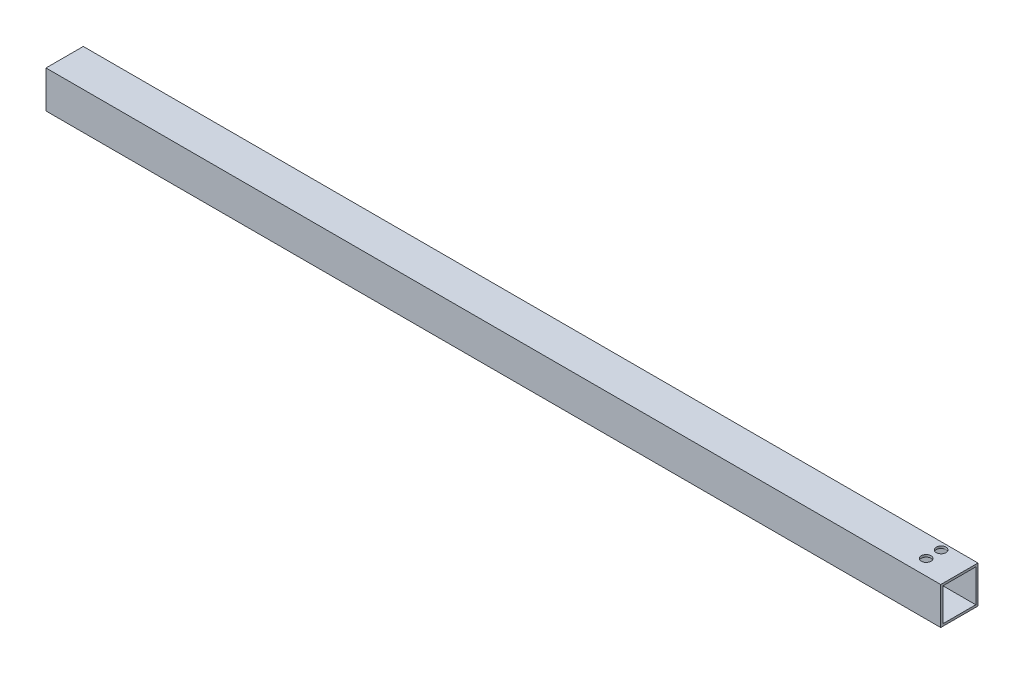
ISO-10303-21;
HEADER;
FILE_DESCRIPTION(('STEP AP214'),'2;1');
FILE_NAME('part.step','',(''),(''),'','','');
FILE_SCHEMA(('AUTOMOTIVE_DESIGN { 1 0 10303 214 1 1 1 1 }'));
ENDSEC;
DATA;
#1=APPLICATION_CONTEXT('core data for automotive mechanical design processes');
#2=APPLICATION_PROTOCOL_DEFINITION('international standard','automotive_design',2000,#1);
#3=PRODUCT_CONTEXT('',#1,'mechanical');
#4=PRODUCT('Part','Part','',(#3));
#5=PRODUCT_RELATED_PRODUCT_CATEGORY('part','',(#4));
#6=PRODUCT_DEFINITION_FORMATION('','',#4);
#7=PRODUCT_DEFINITION_CONTEXT('part definition',#1,'design');
#8=PRODUCT_DEFINITION('design','',#6,#7);
#9=PRODUCT_DEFINITION_SHAPE('','',#8);
#10=(LENGTH_UNIT() NAMED_UNIT(*) SI_UNIT(.MILLI.,.METRE.));
#11=(NAMED_UNIT(*) PLANE_ANGLE_UNIT() SI_UNIT($,.RADIAN.));
#12=(NAMED_UNIT(*) SI_UNIT($,.STERADIAN.) SOLID_ANGLE_UNIT());
#13=UNCERTAINTY_MEASURE_WITH_UNIT(LENGTH_MEASURE(1.E-05),#10,'distance_accuracy_value','');
#14=(GEOMETRIC_REPRESENTATION_CONTEXT(3) GLOBAL_UNCERTAINTY_ASSIGNED_CONTEXT((#13)) GLOBAL_UNIT_ASSIGNED_CONTEXT((#10,
#11,#12)) REPRESENTATION_CONTEXT('',''));
#15=CARTESIAN_POINT('',(0.,0.,0.));
#16=DIRECTION('',(0.,0.,1.));
#17=DIRECTION('',(1.,0.,0.));
#18=AXIS2_PLACEMENT_3D('',#15,#16,#17);
#19=CARTESIAN_POINT('',(1200.,0.,0.));
#20=DIRECTION('',(1.,0.,0.));
#21=DIRECTION('',(0.,0.,-1.));
#22=AXIS2_PLACEMENT_3D('',#19,#20,#21);
#23=PLANE('',#22);
#24=DIRECTION('',(0.,-1.,0.));
#25=VECTOR('',#24,1.);
#26=CARTESIAN_POINT('',(1200.,25.,25.));
#27=LINE('',#26,#25);
#28=CARTESIAN_POINT('',(1200.,25.,25.));
#29=VERTEX_POINT('',#28);
#30=CARTESIAN_POINT('',(1200.,-25.,25.));
#31=VERTEX_POINT('',#30);
#32=EDGE_CURVE('E151',#29,#31,#27,.T.);
#33=ORIENTED_EDGE('',*,*,#32,.T.);
#34=DIRECTION('',(0.,0.,-1.));
#35=VECTOR('',#34,1.);
#36=CARTESIAN_POINT('',(1200.,-25.,25.));
#37=LINE('',#36,#35);
#38=CARTESIAN_POINT('',(1200.,-25.,-25.));
#39=VERTEX_POINT('',#38);
#40=EDGE_CURVE('E154',#31,#39,#37,.T.);
#41=ORIENTED_EDGE('',*,*,#40,.T.);
#42=DIRECTION('',(0.,1.,0.));
#43=VECTOR('',#42,1.);
#44=CARTESIAN_POINT('',(1200.,25.,-25.));
#45=LINE('',#44,#43);
#46=CARTESIAN_POINT('',(1200.,25.,-25.));
#47=VERTEX_POINT('',#46);
#48=EDGE_CURVE('E157',#39,#47,#45,.T.);
#49=ORIENTED_EDGE('',*,*,#48,.T.);
#50=DIRECTION('',(0.,0.,1.));
#51=VECTOR('',#50,1.);
#52=CARTESIAN_POINT('',(1200.,25.,25.));
#53=LINE('',#52,#51);
#54=EDGE_CURVE('E159',#47,#29,#53,.T.);
#55=ORIENTED_EDGE('',*,*,#54,.T.);
#56=EDGE_LOOP('',(#33,#41,#49,#55));
#57=FACE_BOUND('',#56,.T.);
#58=DIRECTION('',(0.,-1.,0.));
#59=VECTOR('',#58,1.);
#60=CARTESIAN_POINT('',(1200.,22.,22.));
#61=LINE('',#60,#59);
#62=CARTESIAN_POINT('',(1200.,22.,22.));
#63=VERTEX_POINT('',#62);
#64=CARTESIAN_POINT('',(1200.,-22.,22.));
#65=VERTEX_POINT('',#64);
#66=EDGE_CURVE('E115',#63,#65,#61,.T.);
#67=ORIENTED_EDGE('',*,*,#66,.F.);
#68=DIRECTION('',(0.,0.,1.));
#69=VECTOR('',#68,1.);
#70=CARTESIAN_POINT('',(1200.,22.,22.));
#71=LINE('',#70,#69);
#72=CARTESIAN_POINT('',(1200.,22.,-22.));
#73=VERTEX_POINT('',#72);
#74=EDGE_CURVE('E103',#73,#63,#71,.T.);
#75=ORIENTED_EDGE('',*,*,#74,.F.);
#76=DIRECTION('',(0.,1.,0.));
#77=VECTOR('',#76,1.);
#78=CARTESIAN_POINT('',(1200.,22.,-22.));
#79=LINE('',#78,#77);
#80=CARTESIAN_POINT('',(1200.,-22.,-22.));
#81=VERTEX_POINT('',#80);
#82=EDGE_CURVE('E130',#81,#73,#79,.T.);
#83=ORIENTED_EDGE('',*,*,#82,.F.);
#84=DIRECTION('',(0.,0.,-1.));
#85=VECTOR('',#84,1.);
#86=CARTESIAN_POINT('',(1200.,-22.,22.));
#87=LINE('',#86,#85);
#88=EDGE_CURVE('E128',#65,#81,#87,.T.);
#89=ORIENTED_EDGE('',*,*,#88,.F.);
#90=EDGE_LOOP('',(#67,#75,#83,#89));
#91=FACE_BOUND('',#90,.T.);
#92=ADVANCED_FACE('F33',(#57,#91),#23,.T.);
#93=CARTESIAN_POINT('',(0.,0.,0.));
#94=DIRECTION('',(1.,0.,0.));
#95=DIRECTION('',(0.,0.,-1.));
#96=AXIS2_PLACEMENT_3D('',#93,#94,#95);
#97=PLANE('',#96);
#98=DIRECTION('',(0.,-1.,0.));
#99=VECTOR('',#98,1.);
#100=CARTESIAN_POINT('',(0.,25.,25.));
#101=LINE('',#100,#99);
#102=CARTESIAN_POINT('',(0.,25.,25.));
#103=VERTEX_POINT('',#102);
#104=CARTESIAN_POINT('',(0.,-25.,25.));
#105=VERTEX_POINT('',#104);
#106=EDGE_CURVE('E123',#103,#105,#101,.T.);
#107=ORIENTED_EDGE('',*,*,#106,.F.);
#108=DIRECTION('',(0.,0.,1.));
#109=VECTOR('',#108,1.);
#110=CARTESIAN_POINT('',(0.,25.,25.));
#111=LINE('',#110,#109);
#112=CARTESIAN_POINT('',(0.,25.,-25.));
#113=VERTEX_POINT('',#112);
#114=EDGE_CURVE('E155',#113,#103,#111,.T.);
#115=ORIENTED_EDGE('',*,*,#114,.F.);
#116=DIRECTION('',(0.,1.,0.));
#117=VECTOR('',#116,1.);
#118=CARTESIAN_POINT('',(0.,25.,-25.));
#119=LINE('',#118,#117);
#120=CARTESIAN_POINT('',(0.,-25.,-25.));
#121=VERTEX_POINT('',#120);
#122=EDGE_CURVE('E166',#121,#113,#119,.T.);
#123=ORIENTED_EDGE('',*,*,#122,.F.);
#124=DIRECTION('',(0.,0.,-1.));
#125=VECTOR('',#124,1.);
#126=CARTESIAN_POINT('',(0.,-25.,25.));
#127=LINE('',#126,#125);
#128=EDGE_CURVE('E164',#105,#121,#127,.T.);
#129=ORIENTED_EDGE('',*,*,#128,.F.);
#130=EDGE_LOOP('',(#107,#115,#123,#129));
#131=FACE_BOUND('',#130,.T.);
#132=DIRECTION('',(0.,0.,1.));
#133=VECTOR('',#132,1.);
#134=CARTESIAN_POINT('',(0.,22.,22.));
#135=LINE('',#134,#133);
#136=CARTESIAN_POINT('',(0.,22.,-22.));
#137=VERTEX_POINT('',#136);
#138=CARTESIAN_POINT('',(0.,22.,22.));
#139=VERTEX_POINT('',#138);
#140=EDGE_CURVE('E136',#137,#139,#135,.T.);
#141=ORIENTED_EDGE('',*,*,#140,.T.);
#142=DIRECTION('',(0.,-1.,0.));
#143=VECTOR('',#142,1.);
#144=CARTESIAN_POINT('',(0.,22.,22.));
#145=LINE('',#144,#143);
#146=CARTESIAN_POINT('',(0.,-22.,22.));
#147=VERTEX_POINT('',#146);
#148=EDGE_CURVE('E122',#139,#147,#145,.T.);
#149=ORIENTED_EDGE('',*,*,#148,.T.);
#150=DIRECTION('',(0.,0.,-1.));
#151=VECTOR('',#150,1.);
#152=CARTESIAN_POINT('',(0.,-22.,22.));
#153=LINE('',#152,#151);
#154=CARTESIAN_POINT('',(0.,-22.,-22.));
#155=VERTEX_POINT('',#154);
#156=EDGE_CURVE('E140',#147,#155,#153,.T.);
#157=ORIENTED_EDGE('',*,*,#156,.T.);
#158=DIRECTION('',(0.,1.,0.));
#159=VECTOR('',#158,1.);
#160=CARTESIAN_POINT('',(0.,22.,-22.));
#161=LINE('',#160,#159);
#162=EDGE_CURVE('E116',#155,#137,#161,.T.);
#163=ORIENTED_EDGE('',*,*,#162,.T.);
#164=EDGE_LOOP('',(#141,#149,#157,#163));
#165=FACE_BOUND('',#164,.T.);
#166=ADVANCED_FACE('F184',(#131,#165),#97,.F.);
#167=CARTESIAN_POINT('',(1200.,25.,25.));
#168=DIRECTION('',(0.,0.,-1.));
#169=DIRECTION('',(0.,1.,0.));
#170=AXIS2_PLACEMENT_3D('',#167,#168,#169);
#171=PLANE('',#170);
#172=ORIENTED_EDGE('',*,*,#106,.T.);
#173=DIRECTION('',(-1.,0.,0.));
#174=VECTOR('',#173,1.);
#175=CARTESIAN_POINT('',(1200.,-25.,25.));
#176=LINE('',#175,#174);
#177=EDGE_CURVE('E11',#31,#105,#176,.T.);
#178=ORIENTED_EDGE('',*,*,#177,.F.);
#179=ORIENTED_EDGE('',*,*,#32,.F.);
#180=DIRECTION('',(-1.,0.,0.));
#181=VECTOR('',#180,1.);
#182=CARTESIAN_POINT('',(1200.,25.,25.));
#183=LINE('',#182,#181);
#184=EDGE_CURVE('E161',#29,#103,#183,.T.);
#185=ORIENTED_EDGE('',*,*,#184,.T.);
#186=EDGE_LOOP('',(#172,#178,#179,#185));
#187=FACE_BOUND('',#186,.T.);
#188=ADVANCED_FACE('F35',(#187),#171,.F.);
#189=CARTESIAN_POINT('',(1200.,-25.,25.));
#190=DIRECTION('',(0.,1.,0.));
#191=DIRECTION('',(0.,0.,1.));
#192=AXIS2_PLACEMENT_3D('',#189,#190,#191);
#193=PLANE('',#192);
#194=CARTESIAN_POINT('',(740.,-25.,-15.5));
#195=DIRECTION('',(0.,-1.,0.));
#196=DIRECTION('',(0.,0.,1.));
#197=AXIS2_PLACEMENT_3D('',#194,#195,#196);
#198=CIRCLE('',#197,6.4999999999999);
#199=CARTESIAN_POINT('',(740.,-25.,-9.00000000000008));
#200=VERTEX_POINT('',#199);
#201=EDGE_CURVE('E311',#200,#200,#198,.T.);
#202=ORIENTED_EDGE('',*,*,#201,.F.);
#203=EDGE_LOOP('',(#202));
#204=FACE_BOUND('',#203,.T.);
#205=CARTESIAN_POINT('',(740.,-25.,4.50000000000001));
#206=DIRECTION('',(0.,-1.,0.));
#207=DIRECTION('',(0.,0.,1.));
#208=AXIS2_PLACEMENT_3D('',#205,#206,#207);
#209=CIRCLE('',#208,6.4999999999999);
#210=CARTESIAN_POINT('',(740.,-25.,10.9999999999999));
#211=VERTEX_POINT('',#210);
#212=EDGE_CURVE('E305',#211,#211,#209,.T.);
#213=ORIENTED_EDGE('',*,*,#212,.F.);
#214=EDGE_LOOP('',(#213));
#215=FACE_BOUND('',#214,.T.);
#216=ORIENTED_EDGE('',*,*,#128,.T.);
#217=DIRECTION('',(-1.,0.,0.));
#218=VECTOR('',#217,1.);
#219=CARTESIAN_POINT('',(1200.,-25.,-25.));
#220=LINE('',#219,#218);
#221=EDGE_CURVE('E41',#39,#121,#220,.T.);
#222=ORIENTED_EDGE('',*,*,#221,.F.);
#223=ORIENTED_EDGE('',*,*,#40,.F.);
#224=ORIENTED_EDGE('',*,*,#177,.T.);
#225=EDGE_LOOP('',(#216,#222,#223,#224));
#226=FACE_BOUND('',#225,.T.);
#227=ADVANCED_FACE('F194',(#204,#215,#226),#193,.F.);
#228=CARTESIAN_POINT('',(1200.,25.,-25.));
#229=DIRECTION('',(0.,0.,1.));
#230=DIRECTION('',(0.,-1.,0.));
#231=AXIS2_PLACEMENT_3D('',#228,#229,#230);
#232=PLANE('',#231);
#233=CARTESIAN_POINT('',(950.,0.,-25.));
#234=DIRECTION('',(0.,0.,-1.));
#235=DIRECTION('',(0.,1.,0.));
#236=AXIS2_PLACEMENT_3D('',#233,#234,#235);
#237=CIRCLE('',#236,19.);
#238=CARTESIAN_POINT('',(950.,19.,-25.));
#239=VERTEX_POINT('',#238);
#240=EDGE_CURVE('E138',#239,#239,#237,.T.);
#241=ORIENTED_EDGE('',*,*,#240,.F.);
#242=EDGE_LOOP('',(#241));
#243=FACE_BOUND('',#242,.T.);
#244=ORIENTED_EDGE('',*,*,#122,.T.);
#245=DIRECTION('',(-1.,0.,0.));
#246=VECTOR('',#245,1.);
#247=CARTESIAN_POINT('',(1200.,25.,-25.));
#248=LINE('',#247,#246);
#249=EDGE_CURVE('E171',#47,#113,#248,.T.);
#250=ORIENTED_EDGE('',*,*,#249,.F.);
#251=ORIENTED_EDGE('',*,*,#48,.F.);
#252=ORIENTED_EDGE('',*,*,#221,.T.);
#253=EDGE_LOOP('',(#244,#250,#251,#252));
#254=FACE_BOUND('',#253,.T.);
#255=ADVANCED_FACE('F178',(#243,#254),#232,.F.);
#256=CARTESIAN_POINT('',(1200.,25.,25.));
#257=DIRECTION('',(0.,-1.,0.));
#258=DIRECTION('',(0.,0.,-1.));
#259=AXIS2_PLACEMENT_3D('',#256,#257,#258);
#260=PLANE('',#259);
#261=CARTESIAN_POINT('',(1160.,25.,-15.5));
#262=DIRECTION('',(0.,1.,0.));
#263=DIRECTION('',(0.,0.,1.));
#264=AXIS2_PLACEMENT_3D('',#261,#262,#263);
#265=CIRCLE('',#264,6.4999999999999);
#266=CARTESIAN_POINT('',(1160.,25.,-9.00000000000009));
#267=VERTEX_POINT('',#266);
#268=EDGE_CURVE('E223',#267,#267,#265,.T.);
#269=ORIENTED_EDGE('',*,*,#268,.F.);
#270=EDGE_LOOP('',(#269));
#271=FACE_BOUND('',#270,.T.);
#272=CARTESIAN_POINT('',(1160.,25.,4.50000000000001));
#273=DIRECTION('',(0.,1.,0.));
#274=DIRECTION('',(0.,0.,1.));
#275=AXIS2_PLACEMENT_3D('',#272,#273,#274);
#276=CIRCLE('',#275,6.4999999999999);
#277=CARTESIAN_POINT('',(1160.,25.,10.9999999999999));
#278=VERTEX_POINT('',#277);
#279=EDGE_CURVE('E226',#278,#278,#276,.T.);
#280=ORIENTED_EDGE('',*,*,#279,.F.);
#281=EDGE_LOOP('',(#280));
#282=FACE_BOUND('',#281,.T.);
#283=ORIENTED_EDGE('',*,*,#114,.T.);
#284=ORIENTED_EDGE('',*,*,#184,.F.);
#285=ORIENTED_EDGE('',*,*,#54,.F.);
#286=ORIENTED_EDGE('',*,*,#249,.T.);
#287=EDGE_LOOP('',(#283,#284,#285,#286));
#288=FACE_BOUND('',#287,.T.);
#289=ADVANCED_FACE('F188',(#271,#282,#288),#260,.F.);
#290=CARTESIAN_POINT('',(1200.,22.,22.));
#291=DIRECTION('',(0.,-1.,0.));
#292=DIRECTION('',(0.,0.,-1.));
#293=AXIS2_PLACEMENT_3D('',#290,#291,#292);
#294=PLANE('',#293);
#295=CARTESIAN_POINT('',(1160.,22.,4.50000000000001));
#296=DIRECTION('',(0.,-1.,0.));
#297=DIRECTION('',(0.,0.,-1.));
#298=AXIS2_PLACEMENT_3D('',#295,#296,#297);
#299=CIRCLE('',#298,6.4999999999999);
#300=CARTESIAN_POINT('',(1160.,22.,-1.9999999999999));
#301=VERTEX_POINT('',#300);
#302=EDGE_CURVE('E229',#301,#301,#299,.F.);
#303=ORIENTED_EDGE('',*,*,#302,.T.);
#304=EDGE_LOOP('',(#303));
#305=FACE_BOUND('',#304,.T.);
#306=DIRECTION('',(-1.,0.,0.));
#307=VECTOR('',#306,1.);
#308=CARTESIAN_POINT('',(1200.,22.,-22.));
#309=LINE('',#308,#307);
#310=CARTESIAN_POINT('',(1160.,22.,-22.));
#311=VERTEX_POINT('',#310);
#312=EDGE_CURVE('E135',#311,#137,#309,.T.);
#313=ORIENTED_EDGE('',*,*,#312,.F.);
#314=CARTESIAN_POINT('',(1160.,22.,-15.5));
#315=DIRECTION('',(0.,-1.,0.));
#316=DIRECTION('',(0.,0.,-1.));
#317=AXIS2_PLACEMENT_3D('',#314,#315,#316);
#318=CIRCLE('',#317,6.4999999999999);
#319=EDGE_CURVE('E51',#311,#311,#318,.F.);
#320=ORIENTED_EDGE('',*,*,#319,.T.);
#321=EDGE_CURVE('E111',#73,#311,#309,.T.);
#322=ORIENTED_EDGE('',*,*,#321,.F.);
#323=ORIENTED_EDGE('',*,*,#74,.T.);
#324=DIRECTION('',(-1.,0.,0.));
#325=VECTOR('',#324,1.);
#326=CARTESIAN_POINT('',(1200.,22.,22.));
#327=LINE('',#326,#325);
#328=EDGE_CURVE('E108',#63,#139,#327,.T.);
#329=ORIENTED_EDGE('',*,*,#328,.T.);
#330=ORIENTED_EDGE('',*,*,#140,.F.);
#331=EDGE_LOOP('',(#313,#320,#322,#323,#329,#330));
#332=FACE_BOUND('',#331,.T.);
#333=ADVANCED_FACE('F106',(#305,#332),#294,.T.);
#334=CARTESIAN_POINT('',(1200.,22.,22.));
#335=DIRECTION('',(0.,0.,-1.));
#336=DIRECTION('',(0.,1.,0.));
#337=AXIS2_PLACEMENT_3D('',#334,#335,#336);
#338=PLANE('',#337);
#339=ORIENTED_EDGE('',*,*,#148,.F.);
#340=ORIENTED_EDGE('',*,*,#328,.F.);
#341=ORIENTED_EDGE('',*,*,#66,.T.);
#342=DIRECTION('',(-1.,0.,0.));
#343=VECTOR('',#342,1.);
#344=CARTESIAN_POINT('',(1200.,-22.,22.));
#345=LINE('',#344,#343);
#346=EDGE_CURVE('E124',#65,#147,#345,.T.);
#347=ORIENTED_EDGE('',*,*,#346,.T.);
#348=EDGE_LOOP('',(#339,#340,#341,#347));
#349=FACE_BOUND('',#348,.T.);
#350=ADVANCED_FACE('F119',(#349),#338,.T.);
#351=CARTESIAN_POINT('',(1200.,-22.,22.));
#352=DIRECTION('',(0.,1.,0.));
#353=DIRECTION('',(0.,0.,1.));
#354=AXIS2_PLACEMENT_3D('',#351,#352,#353);
#355=PLANE('',#354);
#356=CARTESIAN_POINT('',(740.,-22.,4.50000000000001));
#357=DIRECTION('',(0.,1.,0.));
#358=DIRECTION('',(0.,0.,1.));
#359=AXIS2_PLACEMENT_3D('',#356,#357,#358);
#360=CIRCLE('',#359,6.4999999999999);
#361=CARTESIAN_POINT('',(740.,-22.,10.9999999999999));
#362=VERTEX_POINT('',#361);
#363=EDGE_CURVE('E308',#362,#362,#360,.F.);
#364=ORIENTED_EDGE('',*,*,#363,.T.);
#365=EDGE_LOOP('',(#364));
#366=FACE_BOUND('',#365,.T.);
#367=DIRECTION('',(-1.,0.,0.));
#368=VECTOR('',#367,1.);
#369=CARTESIAN_POINT('',(1200.,-22.,-22.));
#370=LINE('',#369,#368);
#371=CARTESIAN_POINT('',(740.,-22.,-22.));
#372=VERTEX_POINT('',#371);
#373=EDGE_CURVE('E147',#81,#372,#370,.T.);
#374=ORIENTED_EDGE('',*,*,#373,.T.);
#375=CARTESIAN_POINT('',(740.,-22.,-15.5));
#376=DIRECTION('',(0.,1.,0.));
#377=DIRECTION('',(0.,0.,1.));
#378=AXIS2_PLACEMENT_3D('',#375,#376,#377);
#379=CIRCLE('',#378,6.4999999999999);
#380=EDGE_CURVE('E46',#372,#372,#379,.F.);
#381=ORIENTED_EDGE('',*,*,#380,.T.);
#382=EDGE_CURVE('E146',#372,#155,#370,.T.);
#383=ORIENTED_EDGE('',*,*,#382,.T.);
#384=ORIENTED_EDGE('',*,*,#156,.F.);
#385=ORIENTED_EDGE('',*,*,#346,.F.);
#386=ORIENTED_EDGE('',*,*,#88,.T.);
#387=EDGE_LOOP('',(#374,#381,#383,#384,#385,#386));
#388=FACE_BOUND('',#387,.T.);
#389=ADVANCED_FACE('F252',(#366,#388),#355,.T.);
#390=CARTESIAN_POINT('',(1200.,22.,-22.));
#391=DIRECTION('',(0.,0.,1.));
#392=DIRECTION('',(0.,-1.,0.));
#393=AXIS2_PLACEMENT_3D('',#390,#391,#392);
#394=PLANE('',#393);
#395=CARTESIAN_POINT('',(950.,0.,-22.));
#396=DIRECTION('',(0.,0.,1.));
#397=DIRECTION('',(0.,-1.,0.));
#398=AXIS2_PLACEMENT_3D('',#395,#396,#397);
#399=CIRCLE('',#398,19.);
#400=CARTESIAN_POINT('',(950.,-19.,-22.));
#401=VERTEX_POINT('',#400);
#402=EDGE_CURVE('E228',#401,#401,#399,.F.);
#403=ORIENTED_EDGE('',*,*,#402,.T.);
#404=EDGE_LOOP('',(#403));
#405=FACE_BOUND('',#404,.T.);
#406=ORIENTED_EDGE('',*,*,#162,.F.);
#407=ORIENTED_EDGE('',*,*,#382,.F.);
#408=ORIENTED_EDGE('',*,*,#373,.F.);
#409=ORIENTED_EDGE('',*,*,#82,.T.);
#410=ORIENTED_EDGE('',*,*,#321,.T.);
#411=ORIENTED_EDGE('',*,*,#312,.T.);
#412=EDGE_LOOP('',(#406,#407,#408,#409,#410,#411));
#413=FACE_BOUND('',#412,.T.);
#414=ADVANCED_FACE('F242',(#405,#413),#394,.T.);
#415=CARTESIAN_POINT('',(950.,0.,25.001));
#416=DIRECTION('',(0.,0.,-1.));
#417=DIRECTION('',(0.,1.,0.));
#418=AXIS2_PLACEMENT_3D('',#415,#416,#417);
#419=CYLINDRICAL_SURFACE('',#418,19.);
#420=ORIENTED_EDGE('',*,*,#402,.F.);
#421=EDGE_LOOP('',(#420));
#422=FACE_BOUND('',#421,.T.);
#423=ORIENTED_EDGE('',*,*,#240,.T.);
#424=EDGE_LOOP('',(#423));
#425=FACE_BOUND('',#424,.T.);
#426=ADVANCED_FACE('F239',(#422,#425),#419,.F.);
#427=CARTESIAN_POINT('',(1160.,-25.001,4.5));
#428=DIRECTION('',(0.,1.,0.));
#429=DIRECTION('',(0.,0.,1.));
#430=AXIS2_PLACEMENT_3D('',#427,#428,#429);
#431=CYLINDRICAL_SURFACE('',#430,6.4999999999999);
#432=ORIENTED_EDGE('',*,*,#302,.F.);
#433=EDGE_LOOP('',(#432));
#434=FACE_BOUND('',#433,.T.);
#435=ORIENTED_EDGE('',*,*,#279,.T.);
#436=EDGE_LOOP('',(#435));
#437=FACE_BOUND('',#436,.T.);
#438=ADVANCED_FACE('F241',(#434,#437),#431,.F.);
#439=CARTESIAN_POINT('',(1160.,-25.001,-15.5));
#440=DIRECTION('',(0.,1.,0.));
#441=DIRECTION('',(0.,0.,1.));
#442=AXIS2_PLACEMENT_3D('',#439,#440,#441);
#443=CYLINDRICAL_SURFACE('',#442,6.4999999999999);
#444=ORIENTED_EDGE('',*,*,#319,.F.);
#445=EDGE_LOOP('',(#444));
#446=FACE_BOUND('',#445,.T.);
#447=ORIENTED_EDGE('',*,*,#268,.T.);
#448=EDGE_LOOP('',(#447));
#449=FACE_BOUND('',#448,.T.);
#450=ADVANCED_FACE('F249',(#446,#449),#443,.F.);
#451=CARTESIAN_POINT('',(740.,25.001,4.5));
#452=DIRECTION('',(0.,-1.,0.));
#453=DIRECTION('',(0.,0.,-1.));
#454=AXIS2_PLACEMENT_3D('',#451,#452,#453);
#455=CYLINDRICAL_SURFACE('',#454,6.4999999999999);
#456=ORIENTED_EDGE('',*,*,#363,.F.);
#457=EDGE_LOOP('',(#456));
#458=FACE_BOUND('',#457,.T.);
#459=ORIENTED_EDGE('',*,*,#212,.T.);
#460=EDGE_LOOP('',(#459));
#461=FACE_BOUND('',#460,.T.);
#462=ADVANCED_FACE('F281',(#458,#461),#455,.F.);
#463=CARTESIAN_POINT('',(740.,25.001,-15.5));
#464=DIRECTION('',(0.,-1.,0.));
#465=DIRECTION('',(0.,0.,-1.));
#466=AXIS2_PLACEMENT_3D('',#463,#464,#465);
#467=CYLINDRICAL_SURFACE('',#466,6.4999999999999);
#468=ORIENTED_EDGE('',*,*,#380,.F.);
#469=EDGE_LOOP('',(#468));
#470=FACE_BOUND('',#469,.T.);
#471=ORIENTED_EDGE('',*,*,#201,.T.);
#472=EDGE_LOOP('',(#471));
#473=FACE_BOUND('',#472,.T.);
#474=ADVANCED_FACE('F286',(#470,#473),#467,.F.);
#475=CLOSED_SHELL('',(#92,#166,#188,#227,#255,#289,#333,#350,#389,#414,#426,#438,#450,#462,#474));
#476=MANIFOLD_SOLID_BREP('B2',#475);
#477=ADVANCED_BREP_SHAPE_REPRESENTATION('',(#18,#476),#14);
#478=SHAPE_DEFINITION_REPRESENTATION(#9,#477);
ENDSEC;
END-ISO-10303-21;
